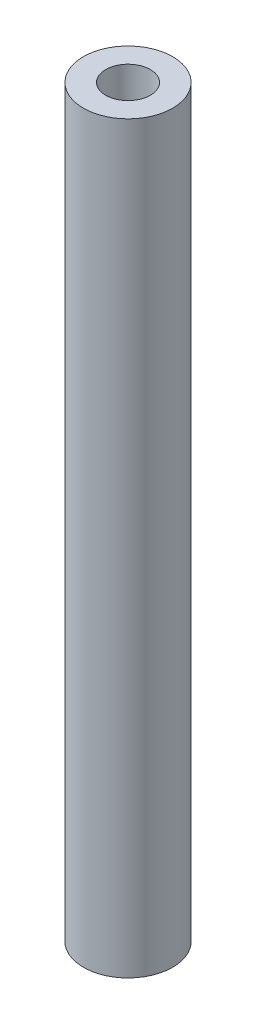
ISO-10303-21;
HEADER;
FILE_DESCRIPTION(('STEP AP214'),'2;1');
FILE_NAME('part.step','',(''),(''),'','','');
FILE_SCHEMA(('AUTOMOTIVE_DESIGN { 1 0 10303 214 1 1 1 1 }'));
ENDSEC;
DATA;
#1=APPLICATION_CONTEXT('core data for automotive mechanical design processes');
#2=APPLICATION_PROTOCOL_DEFINITION('international standard','automotive_design',2000,#1);
#3=PRODUCT_CONTEXT('',#1,'mechanical');
#4=PRODUCT('Part','Part','',(#3));
#5=PRODUCT_RELATED_PRODUCT_CATEGORY('part','',(#4));
#6=PRODUCT_DEFINITION_FORMATION('','',#4);
#7=PRODUCT_DEFINITION_CONTEXT('part definition',#1,'design');
#8=PRODUCT_DEFINITION('design','',#6,#7);
#9=PRODUCT_DEFINITION_SHAPE('','',#8);
#10=(LENGTH_UNIT() NAMED_UNIT(*) SI_UNIT(.MILLI.,.METRE.));
#11=(NAMED_UNIT(*) PLANE_ANGLE_UNIT() SI_UNIT($,.RADIAN.));
#12=(NAMED_UNIT(*) SI_UNIT($,.STERADIAN.) SOLID_ANGLE_UNIT());
#13=UNCERTAINTY_MEASURE_WITH_UNIT(LENGTH_MEASURE(1.E-05),#10,'distance_accuracy_value','');
#14=(GEOMETRIC_REPRESENTATION_CONTEXT(3) GLOBAL_UNCERTAINTY_ASSIGNED_CONTEXT((#13)) GLOBAL_UNIT_ASSIGNED_CONTEXT((#10,
#11,#12)) REPRESENTATION_CONTEXT('',''));
#15=CARTESIAN_POINT('',(0.,0.,0.));
#16=DIRECTION('',(0.,0.,1.));
#17=DIRECTION('',(1.,0.,0.));
#18=AXIS2_PLACEMENT_3D('',#15,#16,#17);
#19=CARTESIAN_POINT('',(0.,50.,0.));
#20=DIRECTION('',(0.,1.,0.));
#21=DIRECTION('',(0.,0.,-1.));
#22=AXIS2_PLACEMENT_3D('',#19,#20,#21);
#23=PLANE('',#22);
#24=CARTESIAN_POINT('',(0.,50.,0.));
#25=DIRECTION('',(0.,-1.,0.));
#26=DIRECTION('',(0.,0.,-1.));
#27=AXIS2_PLACEMENT_3D('',#24,#25,#26);
#28=CIRCLE('',#27,3.);
#29=CARTESIAN_POINT('',(0.,50.,-3.));
#30=VERTEX_POINT('',#29);
#31=EDGE_CURVE('E10',#30,#30,#28,.T.);
#32=ORIENTED_EDGE('',*,*,#31,.F.);
#33=EDGE_LOOP('',(#32));
#34=FACE_BOUND('',#33,.T.);
#35=CARTESIAN_POINT('',(0.,50.,0.));
#36=DIRECTION('',(0.,-1.,0.));
#37=DIRECTION('',(0.,0.,-1.));
#38=AXIS2_PLACEMENT_3D('',#35,#36,#37);
#39=CIRCLE('',#38,1.5);
#40=CARTESIAN_POINT('',(0.,50.,-1.5));
#41=VERTEX_POINT('',#40);
#42=EDGE_CURVE('E55',#41,#41,#39,.T.);
#43=ORIENTED_EDGE('',*,*,#42,.T.);
#44=EDGE_LOOP('',(#43));
#45=FACE_BOUND('',#44,.T.);
#46=ADVANCED_FACE('F41',(#34,#45),#23,.T.);
#47=CARTESIAN_POINT('',(0.,0.,0.));
#48=DIRECTION('',(0.,1.,0.));
#49=DIRECTION('',(0.,0.,-1.));
#50=AXIS2_PLACEMENT_3D('',#47,#48,#49);
#51=PLANE('',#50);
#52=CARTESIAN_POINT('',(0.,0.,0.));
#53=DIRECTION('',(0.,-1.,0.));
#54=DIRECTION('',(0.,0.,-1.));
#55=AXIS2_PLACEMENT_3D('',#52,#53,#54);
#56=CIRCLE('',#55,3.);
#57=CARTESIAN_POINT('',(0.,0.,-3.));
#58=VERTEX_POINT('',#57);
#59=EDGE_CURVE('E44',#58,#58,#56,.T.);
#60=ORIENTED_EDGE('',*,*,#59,.T.);
#61=EDGE_LOOP('',(#60));
#62=FACE_BOUND('',#61,.T.);
#63=CARTESIAN_POINT('',(0.,0.,0.));
#64=DIRECTION('',(0.,-1.,0.));
#65=DIRECTION('',(0.,0.,-1.));
#66=AXIS2_PLACEMENT_3D('',#63,#64,#65);
#67=CIRCLE('',#66,1.5);
#68=CARTESIAN_POINT('',(0.,0.,-1.5));
#69=VERTEX_POINT('',#68);
#70=EDGE_CURVE('E53',#69,#69,#67,.T.);
#71=ORIENTED_EDGE('',*,*,#70,.F.);
#72=EDGE_LOOP('',(#71));
#73=FACE_BOUND('',#72,.T.);
#74=ADVANCED_FACE('F69',(#62,#73),#51,.F.);
#75=CARTESIAN_POINT('',(0.,50.,0.));
#76=DIRECTION('',(0.,-1.,0.));
#77=DIRECTION('',(0.,0.,1.));
#78=AXIS2_PLACEMENT_3D('',#75,#76,#77);
#79=CYLINDRICAL_SURFACE('',#78,3.);
#80=ORIENTED_EDGE('',*,*,#31,.T.);
#81=EDGE_LOOP('',(#80));
#82=FACE_BOUND('',#81,.T.);
#83=ORIENTED_EDGE('',*,*,#59,.F.);
#84=EDGE_LOOP('',(#83));
#85=FACE_BOUND('',#84,.T.);
#86=ADVANCED_FACE('F43',(#82,#85),#79,.T.);
#87=CARTESIAN_POINT('',(0.,50.,0.));
#88=DIRECTION('',(0.,-1.,0.));
#89=DIRECTION('',(0.,0.,1.));
#90=AXIS2_PLACEMENT_3D('',#87,#88,#89);
#91=CYLINDRICAL_SURFACE('',#90,1.5);
#92=ORIENTED_EDGE('',*,*,#42,.F.);
#93=EDGE_LOOP('',(#92));
#94=FACE_BOUND('',#93,.T.);
#95=ORIENTED_EDGE('',*,*,#70,.T.);
#96=EDGE_LOOP('',(#95));
#97=FACE_BOUND('',#96,.T.);
#98=ADVANCED_FACE('F61',(#94,#97),#91,.F.);
#99=CLOSED_SHELL('',(#46,#74,#86,#98));
#100=MANIFOLD_SOLID_BREP('B2',#99);
#101=ADVANCED_BREP_SHAPE_REPRESENTATION('',(#18,#100),#14);
#102=SHAPE_DEFINITION_REPRESENTATION(#9,#101);
ENDSEC;
END-ISO-10303-21;
